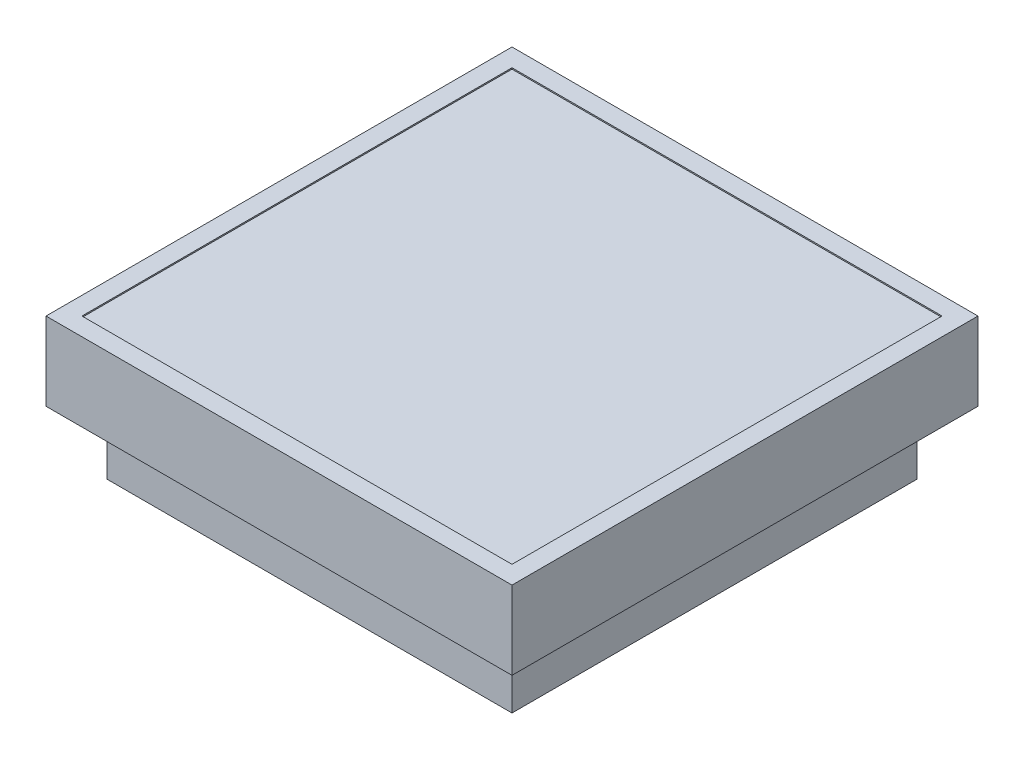
ISO-10303-21;
HEADER;
FILE_DESCRIPTION(('STEP AP214'),'2;1');
FILE_NAME('part.step','',(''),(''),'','','');
FILE_SCHEMA(('AUTOMOTIVE_DESIGN { 1 0 10303 214 1 1 1 1 }'));
ENDSEC;
DATA;
#1=APPLICATION_CONTEXT('core data for automotive mechanical design processes');
#2=APPLICATION_PROTOCOL_DEFINITION('international standard','automotive_design',2000,#1);
#3=PRODUCT_CONTEXT('',#1,'mechanical');
#4=PRODUCT('Part','Part','',(#3));
#5=PRODUCT_RELATED_PRODUCT_CATEGORY('part','',(#4));
#6=PRODUCT_DEFINITION_FORMATION('','',#4);
#7=PRODUCT_DEFINITION_CONTEXT('part definition',#1,'design');
#8=PRODUCT_DEFINITION('design','',#6,#7);
#9=PRODUCT_DEFINITION_SHAPE('','',#8);
#10=(LENGTH_UNIT() NAMED_UNIT(*) SI_UNIT(.MILLI.,.METRE.));
#11=(NAMED_UNIT(*) PLANE_ANGLE_UNIT() SI_UNIT($,.RADIAN.));
#12=(NAMED_UNIT(*) SI_UNIT($,.STERADIAN.) SOLID_ANGLE_UNIT());
#13=UNCERTAINTY_MEASURE_WITH_UNIT(LENGTH_MEASURE(1.E-05),#10,'distance_accuracy_value','');
#14=(GEOMETRIC_REPRESENTATION_CONTEXT(3) GLOBAL_UNCERTAINTY_ASSIGNED_CONTEXT((#13)) GLOBAL_UNIT_ASSIGNED_CONTEXT((#10,
#11,#12)) REPRESENTATION_CONTEXT('',''));
#15=CARTESIAN_POINT('',(0.,0.,0.));
#16=DIRECTION('',(0.,0.,1.));
#17=DIRECTION('',(1.,0.,0.));
#18=AXIS2_PLACEMENT_3D('',#15,#16,#17);
#19=CARTESIAN_POINT('',(0.,0.,0.));
#20=DIRECTION('',(0.,1.,0.));
#21=DIRECTION('',(0.,0.,1.));
#22=AXIS2_PLACEMENT_3D('',#19,#20,#21);
#23=PLANE('',#22);
#24=DIRECTION('',(0.,0.,1.));
#25=VECTOR('',#24,1.);
#26=CARTESIAN_POINT('',(-9.21,0.,9.21));
#27=LINE('',#26,#25);
#28=CARTESIAN_POINT('',(-9.21,0.,-9.21));
#29=VERTEX_POINT('',#28);
#30=CARTESIAN_POINT('',(-9.21,0.,9.21));
#31=VERTEX_POINT('',#30);
#32=EDGE_CURVE('E194',#29,#31,#27,.T.);
#33=ORIENTED_EDGE('',*,*,#32,.F.);
#34=DIRECTION('',(-1.,0.,0.));
#35=VECTOR('',#34,1.);
#36=CARTESIAN_POINT('',(9.21,0.,-9.21));
#37=LINE('',#36,#35);
#38=CARTESIAN_POINT('',(9.21,0.,-9.21));
#39=VERTEX_POINT('',#38);
#40=EDGE_CURVE('E199',#39,#29,#37,.T.);
#41=ORIENTED_EDGE('',*,*,#40,.F.);
#42=DIRECTION('',(0.,0.,-1.));
#43=VECTOR('',#42,1.);
#44=CARTESIAN_POINT('',(9.21,0.,9.21));
#45=LINE('',#44,#43);
#46=CARTESIAN_POINT('',(9.21,0.,9.21));
#47=VERTEX_POINT('',#46);
#48=EDGE_CURVE('E210',#47,#39,#45,.T.);
#49=ORIENTED_EDGE('',*,*,#48,.F.);
#50=DIRECTION('',(1.,0.,0.));
#51=VECTOR('',#50,1.);
#52=CARTESIAN_POINT('',(9.21,0.,9.21));
#53=LINE('',#52,#51);
#54=EDGE_CURVE('E208',#31,#47,#53,.T.);
#55=ORIENTED_EDGE('',*,*,#54,.F.);
#56=EDGE_LOOP('',(#33,#41,#49,#55));
#57=FACE_BOUND('',#56,.T.);
#58=DIRECTION('',(0.,0.,-1.));
#59=VECTOR('',#58,1.);
#60=CARTESIAN_POINT('',(-8.,0.,-8.));
#61=LINE('',#60,#59);
#62=CARTESIAN_POINT('',(-8.,0.,8.));
#63=VERTEX_POINT('',#62);
#64=CARTESIAN_POINT('',(-8.,0.,-8.));
#65=VERTEX_POINT('',#64);
#66=EDGE_CURVE('E161',#63,#65,#61,.T.);
#67=ORIENTED_EDGE('',*,*,#66,.F.);
#68=DIRECTION('',(-1.,0.,0.));
#69=VECTOR('',#68,1.);
#70=CARTESIAN_POINT('',(8.,0.,8.));
#71=LINE('',#70,#69);
#72=CARTESIAN_POINT('',(8.,0.,8.00000000000001));
#73=VERTEX_POINT('',#72);
#74=EDGE_CURVE('E169',#73,#63,#71,.T.);
#75=ORIENTED_EDGE('',*,*,#74,.F.);
#76=DIRECTION('',(0.,0.,1.));
#77=VECTOR('',#76,1.);
#78=CARTESIAN_POINT('',(8.,0.,-8.));
#79=LINE('',#78,#77);
#80=CARTESIAN_POINT('',(8.,0.,-8.));
#81=VERTEX_POINT('',#80);
#82=EDGE_CURVE('E179',#81,#73,#79,.T.);
#83=ORIENTED_EDGE('',*,*,#82,.F.);
#84=DIRECTION('',(1.,0.,0.));
#85=VECTOR('',#84,1.);
#86=CARTESIAN_POINT('',(8.,0.,-8.));
#87=LINE('',#86,#85);
#88=EDGE_CURVE('E60',#65,#81,#87,.T.);
#89=ORIENTED_EDGE('',*,*,#88,.F.);
#90=EDGE_LOOP('',(#67,#75,#83,#89));
#91=FACE_BOUND('',#90,.T.);
#92=ADVANCED_FACE('F37',(#57,#91),#23,.F.);
#93=CARTESIAN_POINT('',(-9.21,3.09,9.21));
#94=DIRECTION('',(1.,0.,0.));
#95=DIRECTION('',(0.,0.,-1.));
#96=AXIS2_PLACEMENT_3D('',#93,#94,#95);
#97=PLANE('',#96);
#98=ORIENTED_EDGE('',*,*,#32,.T.);
#99=DIRECTION('',(0.,-1.,0.));
#100=VECTOR('',#99,1.);
#101=CARTESIAN_POINT('',(-9.21,3.09,9.21));
#102=LINE('',#101,#100);
#103=CARTESIAN_POINT('',(-9.21,3.09,9.21));
#104=VERTEX_POINT('',#103);
#105=EDGE_CURVE('E11',#104,#31,#102,.T.);
#106=ORIENTED_EDGE('',*,*,#105,.F.);
#107=DIRECTION('',(0.,0.,1.));
#108=VECTOR('',#107,1.);
#109=CARTESIAN_POINT('',(-9.21,3.09,9.21));
#110=LINE('',#109,#108);
#111=CARTESIAN_POINT('',(-9.21,3.09,-9.21));
#112=VERTEX_POINT('',#111);
#113=EDGE_CURVE('E195',#112,#104,#110,.T.);
#114=ORIENTED_EDGE('',*,*,#113,.F.);
#115=DIRECTION('',(0.,-1.,0.));
#116=VECTOR('',#115,1.);
#117=CARTESIAN_POINT('',(-9.21,3.09,-9.21));
#118=LINE('',#117,#116);
#119=EDGE_CURVE('E205',#112,#29,#118,.T.);
#120=ORIENTED_EDGE('',*,*,#119,.T.);
#121=EDGE_LOOP('',(#98,#106,#114,#120));
#122=FACE_BOUND('',#121,.T.);
#123=ADVANCED_FACE('F39',(#122),#97,.F.);
#124=CARTESIAN_POINT('',(9.21,3.09,9.21));
#125=DIRECTION('',(0.,0.,-1.));
#126=DIRECTION('',(-1.,0.,0.));
#127=AXIS2_PLACEMENT_3D('',#124,#125,#126);
#128=PLANE('',#127);
#129=ORIENTED_EDGE('',*,*,#54,.T.);
#130=DIRECTION('',(0.,-1.,0.));
#131=VECTOR('',#130,1.);
#132=CARTESIAN_POINT('',(9.21,3.09,9.21));
#133=LINE('',#132,#131);
#134=CARTESIAN_POINT('',(9.21,3.09,9.21));
#135=VERTEX_POINT('',#134);
#136=EDGE_CURVE('E45',#135,#47,#133,.T.);
#137=ORIENTED_EDGE('',*,*,#136,.F.);
#138=DIRECTION('',(1.,0.,0.));
#139=VECTOR('',#138,1.);
#140=CARTESIAN_POINT('',(9.21,3.09,9.21));
#141=LINE('',#140,#139);
#142=EDGE_CURVE('E198',#104,#135,#141,.T.);
#143=ORIENTED_EDGE('',*,*,#142,.F.);
#144=ORIENTED_EDGE('',*,*,#105,.T.);
#145=EDGE_LOOP('',(#129,#137,#143,#144));
#146=FACE_BOUND('',#145,.T.);
#147=ADVANCED_FACE('F237',(#146),#128,.F.);
#148=CARTESIAN_POINT('',(9.21,3.09,9.21));
#149=DIRECTION('',(-1.,0.,0.));
#150=DIRECTION('',(0.,0.,1.));
#151=AXIS2_PLACEMENT_3D('',#148,#149,#150);
#152=PLANE('',#151);
#153=ORIENTED_EDGE('',*,*,#48,.T.);
#154=DIRECTION('',(0.,-1.,0.));
#155=VECTOR('',#154,1.);
#156=CARTESIAN_POINT('',(9.21,3.09,-9.21));
#157=LINE('',#156,#155);
#158=CARTESIAN_POINT('',(9.21,3.09,-9.21));
#159=VERTEX_POINT('',#158);
#160=EDGE_CURVE('E215',#159,#39,#157,.T.);
#161=ORIENTED_EDGE('',*,*,#160,.F.);
#162=DIRECTION('',(0.,0.,-1.));
#163=VECTOR('',#162,1.);
#164=CARTESIAN_POINT('',(9.21,3.09,9.21));
#165=LINE('',#164,#163);
#166=EDGE_CURVE('E201',#135,#159,#165,.T.);
#167=ORIENTED_EDGE('',*,*,#166,.F.);
#168=ORIENTED_EDGE('',*,*,#136,.T.);
#169=EDGE_LOOP('',(#153,#161,#167,#168));
#170=FACE_BOUND('',#169,.T.);
#171=ADVANCED_FACE('F222',(#170),#152,.F.);
#172=CARTESIAN_POINT('',(9.21,3.09,-9.21));
#173=DIRECTION('',(0.,0.,1.));
#174=DIRECTION('',(1.,0.,0.));
#175=AXIS2_PLACEMENT_3D('',#172,#173,#174);
#176=PLANE('',#175);
#177=ORIENTED_EDGE('',*,*,#40,.T.);
#178=ORIENTED_EDGE('',*,*,#119,.F.);
#179=DIRECTION('',(-1.,0.,0.));
#180=VECTOR('',#179,1.);
#181=CARTESIAN_POINT('',(9.21,3.09,-9.21));
#182=LINE('',#181,#180);
#183=EDGE_CURVE('E203',#159,#112,#182,.T.);
#184=ORIENTED_EDGE('',*,*,#183,.F.);
#185=ORIENTED_EDGE('',*,*,#160,.T.);
#186=EDGE_LOOP('',(#177,#178,#184,#185));
#187=FACE_BOUND('',#186,.T.);
#188=ADVANCED_FACE('F230',(#187),#176,.F.);
#189=CARTESIAN_POINT('',(0.,3.09,0.));
#190=DIRECTION('',(0.,1.,0.));
#191=DIRECTION('',(0.,0.,1.));
#192=AXIS2_PLACEMENT_3D('',#189,#190,#191);
#193=PLANE('',#192);
#194=DIRECTION('',(0.,0.,1.));
#195=VECTOR('',#194,1.);
#196=CARTESIAN_POINT('',(-8.5,3.09,8.50000000000001));
#197=LINE('',#196,#195);
#198=CARTESIAN_POINT('',(-8.5,3.09,-8.49999999999999));
#199=VERTEX_POINT('',#198);
#200=CARTESIAN_POINT('',(-8.5,3.09,8.50000000000001));
#201=VERTEX_POINT('',#200);
#202=EDGE_CURVE('E52',#199,#201,#197,.T.);
#203=ORIENTED_EDGE('',*,*,#202,.F.);
#204=DIRECTION('',(-1.,0.,0.));
#205=VECTOR('',#204,1.);
#206=CARTESIAN_POINT('',(8.5,3.09,-8.5));
#207=LINE('',#206,#205);
#208=CARTESIAN_POINT('',(8.5,3.09,-8.5));
#209=VERTEX_POINT('',#208);
#210=EDGE_CURVE('E146',#209,#199,#207,.T.);
#211=ORIENTED_EDGE('',*,*,#210,.F.);
#212=DIRECTION('',(0.,0.,-1.));
#213=VECTOR('',#212,1.);
#214=CARTESIAN_POINT('',(8.5,3.09,8.5));
#215=LINE('',#214,#213);
#216=CARTESIAN_POINT('',(8.5,3.09,8.5));
#217=VERTEX_POINT('',#216);
#218=EDGE_CURVE('E149',#217,#209,#215,.T.);
#219=ORIENTED_EDGE('',*,*,#218,.F.);
#220=DIRECTION('',(1.,0.,0.));
#221=VECTOR('',#220,1.);
#222=CARTESIAN_POINT('',(8.5,3.09,8.5));
#223=LINE('',#222,#221);
#224=EDGE_CURVE('E155',#201,#217,#223,.T.);
#225=ORIENTED_EDGE('',*,*,#224,.F.);
#226=EDGE_LOOP('',(#203,#211,#219,#225));
#227=FACE_BOUND('',#226,.T.);
#228=ORIENTED_EDGE('',*,*,#113,.T.);
#229=ORIENTED_EDGE('',*,*,#142,.T.);
#230=ORIENTED_EDGE('',*,*,#166,.T.);
#231=ORIENTED_EDGE('',*,*,#183,.T.);
#232=EDGE_LOOP('',(#228,#229,#230,#231));
#233=FACE_BOUND('',#232,.T.);
#234=ADVANCED_FACE('F236',(#227,#233),#193,.T.);
#235=CARTESIAN_POINT('',(-8.,-2.5,-8.));
#236=DIRECTION('',(1.,0.,0.));
#237=DIRECTION('',(0.,0.,-1.));
#238=AXIS2_PLACEMENT_3D('',#235,#236,#237);
#239=PLANE('',#238);
#240=ORIENTED_EDGE('',*,*,#66,.T.);
#241=DIRECTION('',(0.,1.,0.));
#242=VECTOR('',#241,1.);
#243=CARTESIAN_POINT('',(-8.,-2.5,-8.));
#244=LINE('',#243,#242);
#245=CARTESIAN_POINT('',(-8.,-2.5,-8.));
#246=VERTEX_POINT('',#245);
#247=EDGE_CURVE('E192',#246,#65,#244,.T.);
#248=ORIENTED_EDGE('',*,*,#247,.F.);
#249=DIRECTION('',(0.,0.,-1.));
#250=VECTOR('',#249,1.);
#251=CARTESIAN_POINT('',(-8.,-2.5,-8.));
#252=LINE('',#251,#250);
#253=CARTESIAN_POINT('',(-8.,-2.5,8.));
#254=VERTEX_POINT('',#253);
#255=EDGE_CURVE('E165',#254,#246,#252,.T.);
#256=ORIENTED_EDGE('',*,*,#255,.F.);
#257=DIRECTION('',(0.,1.,0.));
#258=VECTOR('',#257,1.);
#259=CARTESIAN_POINT('',(-8.,-2.5,8.));
#260=LINE('',#259,#258);
#261=EDGE_CURVE('E175',#254,#63,#260,.T.);
#262=ORIENTED_EDGE('',*,*,#261,.T.);
#263=EDGE_LOOP('',(#240,#248,#256,#262));
#264=FACE_BOUND('',#263,.T.);
#265=ADVANCED_FACE('F256',(#264),#239,.F.);
#266=CARTESIAN_POINT('',(8.,-2.5,-8.));
#267=DIRECTION('',(0.,0.,1.));
#268=DIRECTION('',(1.,0.,0.));
#269=AXIS2_PLACEMENT_3D('',#266,#267,#268);
#270=PLANE('',#269);
#271=ORIENTED_EDGE('',*,*,#88,.T.);
#272=DIRECTION('',(0.,1.,0.));
#273=VECTOR('',#272,1.);
#274=CARTESIAN_POINT('',(8.,-2.5,-8.));
#275=LINE('',#274,#273);
#276=CARTESIAN_POINT('',(8.,-2.5,-8.));
#277=VERTEX_POINT('',#276);
#278=EDGE_CURVE('E189',#277,#81,#275,.T.);
#279=ORIENTED_EDGE('',*,*,#278,.F.);
#280=DIRECTION('',(1.,0.,0.));
#281=VECTOR('',#280,1.);
#282=CARTESIAN_POINT('',(8.,-2.5,-8.));
#283=LINE('',#282,#281);
#284=EDGE_CURVE('E168',#246,#277,#283,.T.);
#285=ORIENTED_EDGE('',*,*,#284,.F.);
#286=ORIENTED_EDGE('',*,*,#247,.T.);
#287=EDGE_LOOP('',(#271,#279,#285,#286));
#288=FACE_BOUND('',#287,.T.);
#289=ADVANCED_FACE('F262',(#288),#270,.F.);
#290=CARTESIAN_POINT('',(8.,-2.5,-8.));
#291=DIRECTION('',(-1.,0.,0.));
#292=DIRECTION('',(0.,0.,1.));
#293=AXIS2_PLACEMENT_3D('',#290,#291,#292);
#294=PLANE('',#293);
#295=ORIENTED_EDGE('',*,*,#82,.T.);
#296=DIRECTION('',(0.,1.,0.));
#297=VECTOR('',#296,1.);
#298=CARTESIAN_POINT('',(8.,-2.5,8.));
#299=LINE('',#298,#297);
#300=CARTESIAN_POINT('',(8.,-2.5,8.));
#301=VERTEX_POINT('',#300);
#302=EDGE_CURVE('E186',#301,#73,#299,.T.);
#303=ORIENTED_EDGE('',*,*,#302,.F.);
#304=DIRECTION('',(0.,0.,1.));
#305=VECTOR('',#304,1.);
#306=CARTESIAN_POINT('',(8.,-2.5,-8.));
#307=LINE('',#306,#305);
#308=EDGE_CURVE('E171',#277,#301,#307,.T.);
#309=ORIENTED_EDGE('',*,*,#308,.F.);
#310=ORIENTED_EDGE('',*,*,#278,.T.);
#311=EDGE_LOOP('',(#295,#303,#309,#310));
#312=FACE_BOUND('',#311,.T.);
#313=ADVANCED_FACE('F289',(#312),#294,.F.);
#314=CARTESIAN_POINT('',(8.,-2.5,8.));
#315=DIRECTION('',(0.,0.,-1.));
#316=DIRECTION('',(-1.,0.,0.));
#317=AXIS2_PLACEMENT_3D('',#314,#315,#316);
#318=PLANE('',#317);
#319=ORIENTED_EDGE('',*,*,#74,.T.);
#320=ORIENTED_EDGE('',*,*,#261,.F.);
#321=DIRECTION('',(-1.,0.,0.));
#322=VECTOR('',#321,1.);
#323=CARTESIAN_POINT('',(8.,-2.5,8.));
#324=LINE('',#323,#322);
#325=EDGE_CURVE('E173',#301,#254,#324,.T.);
#326=ORIENTED_EDGE('',*,*,#325,.F.);
#327=ORIENTED_EDGE('',*,*,#302,.T.);
#328=EDGE_LOOP('',(#319,#320,#326,#327));
#329=FACE_BOUND('',#328,.T.);
#330=ADVANCED_FACE('F285',(#329),#318,.F.);
#331=CARTESIAN_POINT('',(0.,-2.5,0.));
#332=DIRECTION('',(0.,-1.,0.));
#333=DIRECTION('',(0.,0.,-1.));
#334=AXIS2_PLACEMENT_3D('',#331,#332,#333);
#335=PLANE('',#334);
#336=ORIENTED_EDGE('',*,*,#255,.T.);
#337=ORIENTED_EDGE('',*,*,#284,.T.);
#338=ORIENTED_EDGE('',*,*,#308,.T.);
#339=ORIENTED_EDGE('',*,*,#325,.T.);
#340=EDGE_LOOP('',(#336,#337,#338,#339));
#341=FACE_BOUND('',#340,.T.);
#342=ADVANCED_FACE('F277',(#341),#335,.T.);
#343=CARTESIAN_POINT('',(-8.5,3.04,8.50000000000001));
#344=DIRECTION('',(-1.,0.,0.));
#345=DIRECTION('',(0.,0.,1.));
#346=AXIS2_PLACEMENT_3D('',#343,#344,#345);
#347=PLANE('',#346);
#348=ORIENTED_EDGE('',*,*,#202,.T.);
#349=DIRECTION('',(0.,1.,0.));
#350=VECTOR('',#349,1.);
#351=CARTESIAN_POINT('',(-8.5,3.04,8.50000000000001));
#352=LINE('',#351,#350);
#353=CARTESIAN_POINT('',(-8.5,3.04,8.50000000000001));
#354=VERTEX_POINT('',#353);
#355=EDGE_CURVE('E124',#354,#201,#352,.T.);
#356=ORIENTED_EDGE('',*,*,#355,.F.);
#357=DIRECTION('',(0.,0.,1.));
#358=VECTOR('',#357,1.);
#359=CARTESIAN_POINT('',(-8.5,3.04,8.50000000000001));
#360=LINE('',#359,#358);
#361=CARTESIAN_POINT('',(-8.5,3.04,-8.49999999999999));
#362=VERTEX_POINT('',#361);
#363=EDGE_CURVE('E128',#362,#354,#360,.T.);
#364=ORIENTED_EDGE('',*,*,#363,.F.);
#365=DIRECTION('',(0.,1.,0.));
#366=VECTOR('',#365,1.);
#367=CARTESIAN_POINT('',(-8.5,3.04,-8.49999999999999));
#368=LINE('',#367,#366);
#369=EDGE_CURVE('E159',#362,#199,#368,.T.);
#370=ORIENTED_EDGE('',*,*,#369,.T.);
#371=EDGE_LOOP('',(#348,#356,#364,#370));
#372=FACE_BOUND('',#371,.T.);
#373=ADVANCED_FACE('F126',(#372),#347,.F.);
#374=CARTESIAN_POINT('',(8.5,3.04,-8.5));
#375=DIRECTION('',(0.,0.,-1.));
#376=DIRECTION('',(-1.,0.,0.));
#377=AXIS2_PLACEMENT_3D('',#374,#375,#376);
#378=PLANE('',#377);
#379=ORIENTED_EDGE('',*,*,#210,.T.);
#380=ORIENTED_EDGE('',*,*,#369,.F.);
#381=DIRECTION('',(-1.,0.,0.));
#382=VECTOR('',#381,1.);
#383=CARTESIAN_POINT('',(8.5,3.04,-8.5));
#384=LINE('',#383,#382);
#385=CARTESIAN_POINT('',(8.5,3.04,-8.5));
#386=VERTEX_POINT('',#385);
#387=EDGE_CURVE('E134',#386,#362,#384,.T.);
#388=ORIENTED_EDGE('',*,*,#387,.F.);
#389=DIRECTION('',(0.,1.,0.));
#390=VECTOR('',#389,1.);
#391=CARTESIAN_POINT('',(8.5,3.04,-8.5));
#392=LINE('',#391,#390);
#393=EDGE_CURVE('E162',#386,#209,#392,.T.);
#394=ORIENTED_EDGE('',*,*,#393,.T.);
#395=EDGE_LOOP('',(#379,#380,#388,#394));
#396=FACE_BOUND('',#395,.T.);
#397=ADVANCED_FACE('F269',(#396),#378,.F.);
#398=CARTESIAN_POINT('',(8.5,3.04,8.5));
#399=DIRECTION('',(1.,0.,0.));
#400=DIRECTION('',(0.,0.,-1.));
#401=AXIS2_PLACEMENT_3D('',#398,#399,#400);
#402=PLANE('',#401);
#403=ORIENTED_EDGE('',*,*,#218,.T.);
#404=ORIENTED_EDGE('',*,*,#393,.F.);
#405=DIRECTION('',(0.,0.,-1.));
#406=VECTOR('',#405,1.);
#407=CARTESIAN_POINT('',(8.5,3.04,8.5));
#408=LINE('',#407,#406);
#409=CARTESIAN_POINT('',(8.5,3.04,8.5));
#410=VERTEX_POINT('',#409);
#411=EDGE_CURVE('E142',#410,#386,#408,.T.);
#412=ORIENTED_EDGE('',*,*,#411,.F.);
#413=DIRECTION('',(0.,1.,0.));
#414=VECTOR('',#413,1.);
#415=CARTESIAN_POINT('',(8.5,3.04,8.5));
#416=LINE('',#415,#414);
#417=EDGE_CURVE('E133',#410,#217,#416,.T.);
#418=ORIENTED_EDGE('',*,*,#417,.T.);
#419=EDGE_LOOP('',(#403,#404,#412,#418));
#420=FACE_BOUND('',#419,.T.);
#421=ADVANCED_FACE('F267',(#420),#402,.F.);
#422=CARTESIAN_POINT('',(8.5,3.04,8.5));
#423=DIRECTION('',(0.,0.,1.));
#424=DIRECTION('',(1.,0.,0.));
#425=AXIS2_PLACEMENT_3D('',#422,#423,#424);
#426=PLANE('',#425);
#427=ORIENTED_EDGE('',*,*,#224,.T.);
#428=ORIENTED_EDGE('',*,*,#417,.F.);
#429=DIRECTION('',(1.,0.,0.));
#430=VECTOR('',#429,1.);
#431=CARTESIAN_POINT('',(8.5,3.04,8.5));
#432=LINE('',#431,#430);
#433=EDGE_CURVE('E137',#354,#410,#432,.T.);
#434=ORIENTED_EDGE('',*,*,#433,.F.);
#435=ORIENTED_EDGE('',*,*,#355,.T.);
#436=EDGE_LOOP('',(#427,#428,#434,#435));
#437=FACE_BOUND('',#436,.T.);
#438=ADVANCED_FACE('F138',(#437),#426,.F.);
#439=CARTESIAN_POINT('',(0.,3.04,0.));
#440=DIRECTION('',(0.,1.,0.));
#441=DIRECTION('',(0.,0.,1.));
#442=AXIS2_PLACEMENT_3D('',#439,#440,#441);
#443=PLANE('',#442);
#444=ORIENTED_EDGE('',*,*,#363,.T.);
#445=ORIENTED_EDGE('',*,*,#433,.T.);
#446=ORIENTED_EDGE('',*,*,#411,.T.);
#447=ORIENTED_EDGE('',*,*,#387,.T.);
#448=EDGE_LOOP('',(#444,#445,#446,#447));
#449=FACE_BOUND('',#448,.T.);
#450=ADVANCED_FACE('F144',(#449),#443,.T.);
#451=CLOSED_SHELL('',(#92,#123,#147,#171,#188,#234,#265,#289,#313,#330,#342,#373,#397,#421,#438,#450));
#452=MANIFOLD_SOLID_BREP('B2',#451);
#453=ADVANCED_BREP_SHAPE_REPRESENTATION('',(#18,#452),#14);
#454=SHAPE_DEFINITION_REPRESENTATION(#9,#453);
ENDSEC;
END-ISO-10303-21;
